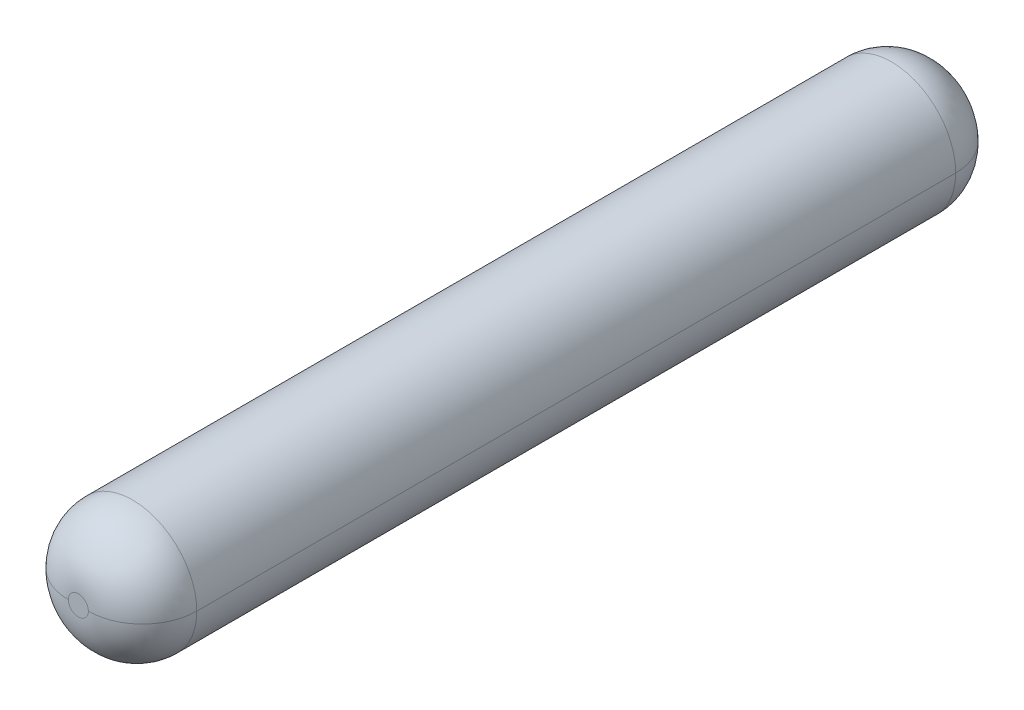
ISO-10303-21;
HEADER;
FILE_DESCRIPTION(('STEP AP214'),'2;1');
FILE_NAME('part.step','',(''),(''),'','','');
FILE_SCHEMA(('AUTOMOTIVE_DESIGN { 1 0 10303 214 1 1 1 1 }'));
ENDSEC;
DATA;
#1=APPLICATION_CONTEXT('core data for automotive mechanical design processes');
#2=APPLICATION_PROTOCOL_DEFINITION('international standard','automotive_design',2000,#1);
#3=PRODUCT_CONTEXT('',#1,'mechanical');
#4=PRODUCT('Part','Part','',(#3));
#5=PRODUCT_RELATED_PRODUCT_CATEGORY('part','',(#4));
#6=PRODUCT_DEFINITION_FORMATION('','',#4);
#7=PRODUCT_DEFINITION_CONTEXT('part definition',#1,'design');
#8=PRODUCT_DEFINITION('design','',#6,#7);
#9=PRODUCT_DEFINITION_SHAPE('','',#8);
#10=(LENGTH_UNIT() NAMED_UNIT(*) SI_UNIT(.MILLI.,.METRE.));
#11=(NAMED_UNIT(*) PLANE_ANGLE_UNIT() SI_UNIT($,.RADIAN.));
#12=(NAMED_UNIT(*) SI_UNIT($,.STERADIAN.) SOLID_ANGLE_UNIT());
#13=UNCERTAINTY_MEASURE_WITH_UNIT(LENGTH_MEASURE(1.E-05),#10,'distance_accuracy_value','');
#14=(GEOMETRIC_REPRESENTATION_CONTEXT(3) GLOBAL_UNCERTAINTY_ASSIGNED_CONTEXT((#13)) GLOBAL_UNIT_ASSIGNED_CONTEXT((#10,
#11,#12)) REPRESENTATION_CONTEXT('',''));
#15=CARTESIAN_POINT('',(0.,0.,0.));
#16=DIRECTION('',(0.,0.,1.));
#17=DIRECTION('',(1.,0.,0.));
#18=AXIS2_PLACEMENT_3D('',#15,#16,#17);
#19=CARTESIAN_POINT('',(0.,7.026275,9.525));
#20=DIRECTION('',(0.,0.,1.));
#21=DIRECTION('',(1.,0.,0.));
#22=AXIS2_PLACEMENT_3D('',#19,#20,#21);
#23=DEGENERATE_TOROIDAL_SURFACE('',#22,0.117475000000008,0.635,.T.);
#24=CARTESIAN_POINT('',(-0.117475000000085,7.026275,9.525));
#25=DIRECTION('',(0.,1.,0.));
#26=DIRECTION('',(-1.,0.,0.));
#27=AXIS2_PLACEMENT_3D('',#24,#25,#26);
#28=CIRCLE('',#27,0.635);
#29=CARTESIAN_POINT('',(-0.752475000000085,7.026275,9.525));
#30=VERTEX_POINT('',#29);
#31=CARTESIAN_POINT('',(-0.117475000000085,7.026275,10.16));
#32=VERTEX_POINT('',#31);
#33=EDGE_CURVE('E75',#30,#32,#28,.T.);
#34=ORIENTED_EDGE('',*,*,#33,.F.);
#35=CARTESIAN_POINT('',(0.,7.026275,9.525));
#36=DIRECTION('',(0.,0.,-1.));
#37=DIRECTION('',(1.,0.,0.));
#38=AXIS2_PLACEMENT_3D('',#35,#36,#37);
#39=CIRCLE('',#38,0.752475);
#40=CARTESIAN_POINT('',(0.752474999999932,7.026275,9.525));
#41=VERTEX_POINT('',#40);
#42=EDGE_CURVE('E70',#41,#30,#39,.T.);
#43=ORIENTED_EDGE('',*,*,#42,.F.);
#44=CARTESIAN_POINT('',(0.117474999999932,7.026275,9.525));
#45=DIRECTION('',(0.,-1.,0.));
#46=DIRECTION('',(0.,0.,-1.));
#47=AXIS2_PLACEMENT_3D('',#44,#45,#46);
#48=CIRCLE('',#47,0.635);
#49=CARTESIAN_POINT('',(0.117474999999932,7.026275,10.16));
#50=VERTEX_POINT('',#49);
#51=EDGE_CURVE('E72',#41,#50,#48,.T.);
#52=ORIENTED_EDGE('',*,*,#51,.T.);
#53=CARTESIAN_POINT('',(0.,7.026275,10.16));
#54=DIRECTION('',(0.,0.,1.));
#55=DIRECTION('',(1.,0.,0.));
#56=AXIS2_PLACEMENT_3D('',#53,#54,#55);
#57=CIRCLE('',#56,0.117475000000008);
#58=EDGE_CURVE('E28',#32,#50,#57,.T.);
#59=ORIENTED_EDGE('',*,*,#58,.F.);
#60=EDGE_LOOP('',(#34,#43,#52,#59));
#61=FACE_BOUND('',#60,.T.);
#62=ADVANCED_FACE('F17',(#61),#23,.T.);
#63=CARTESIAN_POINT('',(0.,7.026275,0.635));
#64=DIRECTION('',(0.,0.,1.));
#65=DIRECTION('',(1.,0.,0.));
#66=AXIS2_PLACEMENT_3D('',#63,#64,#65);
#67=DEGENERATE_TOROIDAL_SURFACE('',#66,0.117475000000008,0.635,.T.);
#68=CARTESIAN_POINT('',(-0.117475000000085,7.026275,0.635));
#69=DIRECTION('',(0.,1.,0.));
#70=DIRECTION('',(-1.,0.,0.));
#71=AXIS2_PLACEMENT_3D('',#68,#69,#70);
#72=CIRCLE('',#71,0.635);
#73=CARTESIAN_POINT('',(-0.117475000000085,7.026275,0.));
#74=VERTEX_POINT('',#73);
#75=CARTESIAN_POINT('',(-0.752475000000085,7.026275,0.635));
#76=VERTEX_POINT('',#75);
#77=EDGE_CURVE('E107',#74,#76,#72,.T.);
#78=ORIENTED_EDGE('',*,*,#77,.F.);
#79=CARTESIAN_POINT('',(0.,7.026275,0.));
#80=DIRECTION('',(0.,0.,-1.));
#81=DIRECTION('',(1.,0.,0.));
#82=AXIS2_PLACEMENT_3D('',#79,#80,#81);
#83=CIRCLE('',#82,0.117475000000008);
#84=CARTESIAN_POINT('',(0.117474999999932,7.026275,0.));
#85=VERTEX_POINT('',#84);
#86=EDGE_CURVE('E11',#85,#74,#83,.T.);
#87=ORIENTED_EDGE('',*,*,#86,.F.);
#88=CARTESIAN_POINT('',(0.117474999999932,7.026275,0.635));
#89=DIRECTION('',(0.,-1.,0.));
#90=DIRECTION('',(0.,0.,-1.));
#91=AXIS2_PLACEMENT_3D('',#88,#89,#90);
#92=CIRCLE('',#91,0.635);
#93=CARTESIAN_POINT('',(0.752474999999932,7.026275,0.635));
#94=VERTEX_POINT('',#93);
#95=EDGE_CURVE('E88',#85,#94,#92,.T.);
#96=ORIENTED_EDGE('',*,*,#95,.T.);
#97=CARTESIAN_POINT('',(0.,7.026275,0.635));
#98=DIRECTION('',(0.,0.,1.));
#99=DIRECTION('',(1.,0.,0.));
#100=AXIS2_PLACEMENT_3D('',#97,#98,#99);
#101=CIRCLE('',#100,0.752475);
#102=EDGE_CURVE('E43',#76,#94,#101,.T.);
#103=ORIENTED_EDGE('',*,*,#102,.F.);
#104=EDGE_LOOP('',(#78,#87,#96,#103));
#105=FACE_BOUND('',#104,.T.);
#106=ADVANCED_FACE('F132',(#105),#67,.T.);
#107=CARTESIAN_POINT('',(0.,7.026275,0.));
#108=DIRECTION('',(0.,0.,1.));
#109=DIRECTION('',(1.,0.,0.));
#110=AXIS2_PLACEMENT_3D('',#107,#108,#109);
#111=PLANE('',#110);
#112=ORIENTED_EDGE('',*,*,#86,.T.);
#113=CARTESIAN_POINT('',(0.,7.026275,0.));
#114=DIRECTION('',(0.,0.,-1.));
#115=DIRECTION('',(1.,0.,0.));
#116=AXIS2_PLACEMENT_3D('',#113,#114,#115);
#117=CIRCLE('',#116,0.117475000000008);
#118=EDGE_CURVE('E95',#74,#85,#117,.T.);
#119=ORIENTED_EDGE('',*,*,#118,.T.);
#120=EDGE_LOOP('',(#112,#119));
#121=FACE_BOUND('',#120,.T.);
#122=ADVANCED_FACE('F123',(#121),#111,.F.);
#123=CARTESIAN_POINT('',(0.,7.026275,10.16));
#124=DIRECTION('',(0.,0.,1.));
#125=DIRECTION('',(1.,0.,0.));
#126=AXIS2_PLACEMENT_3D('',#123,#124,#125);
#127=PLANE('',#126);
#128=CARTESIAN_POINT('',(0.,7.026275,10.16));
#129=DIRECTION('',(0.,0.,1.));
#130=DIRECTION('',(1.,0.,0.));
#131=AXIS2_PLACEMENT_3D('',#128,#129,#130);
#132=CIRCLE('',#131,0.117475000000008);
#133=EDGE_CURVE('E93',#50,#32,#132,.T.);
#134=ORIENTED_EDGE('',*,*,#133,.T.);
#135=ORIENTED_EDGE('',*,*,#58,.T.);
#136=EDGE_LOOP('',(#134,#135));
#137=FACE_BOUND('',#136,.T.);
#138=ADVANCED_FACE('F121',(#137),#127,.T.);
#139=CARTESIAN_POINT('',(0.,7.026275,10.16));
#140=DIRECTION('',(0.,0.,-1.));
#141=DIRECTION('',(-1.,0.,0.));
#142=AXIS2_PLACEMENT_3D('',#139,#140,#141);
#143=CYLINDRICAL_SURFACE('',#142,0.752475);
#144=DIRECTION('',(0.,0.,-1.));
#145=VECTOR('',#144,1.);
#146=CARTESIAN_POINT('',(0.752474999999932,7.026275,10.16));
#147=LINE('',#146,#145);
#148=EDGE_CURVE('E81',#41,#94,#147,.T.);
#149=ORIENTED_EDGE('',*,*,#148,.F.);
#150=ORIENTED_EDGE('',*,*,#42,.T.);
#151=DIRECTION('',(0.,0.,-1.));
#152=VECTOR('',#151,1.);
#153=CARTESIAN_POINT('',(-0.752475000000085,7.026275,10.16));
#154=LINE('',#153,#152);
#155=EDGE_CURVE('E79',#30,#76,#154,.T.);
#156=ORIENTED_EDGE('',*,*,#155,.T.);
#157=ORIENTED_EDGE('',*,*,#102,.T.);
#158=EDGE_LOOP('',(#149,#150,#156,#157));
#159=FACE_BOUND('',#158,.T.);
#160=ADVANCED_FACE('F82',(#159),#143,.T.);
#161=CARTESIAN_POINT('',(0.,7.026275,10.16));
#162=DIRECTION('',(0.,0.,-1.));
#163=DIRECTION('',(-1.,0.,0.));
#164=AXIS2_PLACEMENT_3D('',#161,#162,#163);
#165=CYLINDRICAL_SURFACE('',#164,0.752475);
#166=CARTESIAN_POINT('',(0.,7.026275,9.525));
#167=DIRECTION('',(0.,0.,-1.));
#168=DIRECTION('',(1.,0.,0.));
#169=AXIS2_PLACEMENT_3D('',#166,#167,#168);
#170=CIRCLE('',#169,0.752475);
#171=EDGE_CURVE('E91',#30,#41,#170,.T.);
#172=ORIENTED_EDGE('',*,*,#171,.T.);
#173=ORIENTED_EDGE('',*,*,#148,.T.);
#174=CARTESIAN_POINT('',(0.,7.026275,0.635));
#175=DIRECTION('',(0.,0.,1.));
#176=DIRECTION('',(1.,0.,0.));
#177=AXIS2_PLACEMENT_3D('',#174,#175,#176);
#178=CIRCLE('',#177,0.752475);
#179=EDGE_CURVE('E21',#94,#76,#178,.T.);
#180=ORIENTED_EDGE('',*,*,#179,.T.);
#181=ORIENTED_EDGE('',*,*,#155,.F.);
#182=EDGE_LOOP('',(#172,#173,#180,#181));
#183=FACE_BOUND('',#182,.T.);
#184=ADVANCED_FACE('F96',(#183),#165,.T.);
#185=CARTESIAN_POINT('',(0.,7.026275,0.635));
#186=DIRECTION('',(0.,0.,1.));
#187=DIRECTION('',(1.,0.,0.));
#188=AXIS2_PLACEMENT_3D('',#185,#186,#187);
#189=DEGENERATE_TOROIDAL_SURFACE('',#188,0.117475000000008,0.635,.T.);
#190=ORIENTED_EDGE('',*,*,#118,.F.);
#191=ORIENTED_EDGE('',*,*,#77,.T.);
#192=ORIENTED_EDGE('',*,*,#179,.F.);
#193=ORIENTED_EDGE('',*,*,#95,.F.);
#194=EDGE_LOOP('',(#190,#191,#192,#193));
#195=FACE_BOUND('',#194,.T.);
#196=ADVANCED_FACE('F148',(#195),#189,.T.);
#197=CARTESIAN_POINT('',(0.,7.026275,9.525));
#198=DIRECTION('',(0.,0.,1.));
#199=DIRECTION('',(1.,0.,0.));
#200=AXIS2_PLACEMENT_3D('',#197,#198,#199);
#201=DEGENERATE_TOROIDAL_SURFACE('',#200,0.117475000000008,0.635,.T.);
#202=ORIENTED_EDGE('',*,*,#171,.F.);
#203=ORIENTED_EDGE('',*,*,#33,.T.);
#204=ORIENTED_EDGE('',*,*,#133,.F.);
#205=ORIENTED_EDGE('',*,*,#51,.F.);
#206=EDGE_LOOP('',(#202,#203,#204,#205));
#207=FACE_BOUND('',#206,.T.);
#208=ADVANCED_FACE('F19',(#207),#201,.T.);
#209=CLOSED_SHELL('',(#62,#106,#122,#138,#160,#184,#196,#208));
#210=MANIFOLD_SOLID_BREP('B1',#209);
#211=ADVANCED_BREP_SHAPE_REPRESENTATION('',(#18,#210),#14);
#212=SHAPE_DEFINITION_REPRESENTATION(#9,#211);
ENDSEC;
END-ISO-10303-21;
